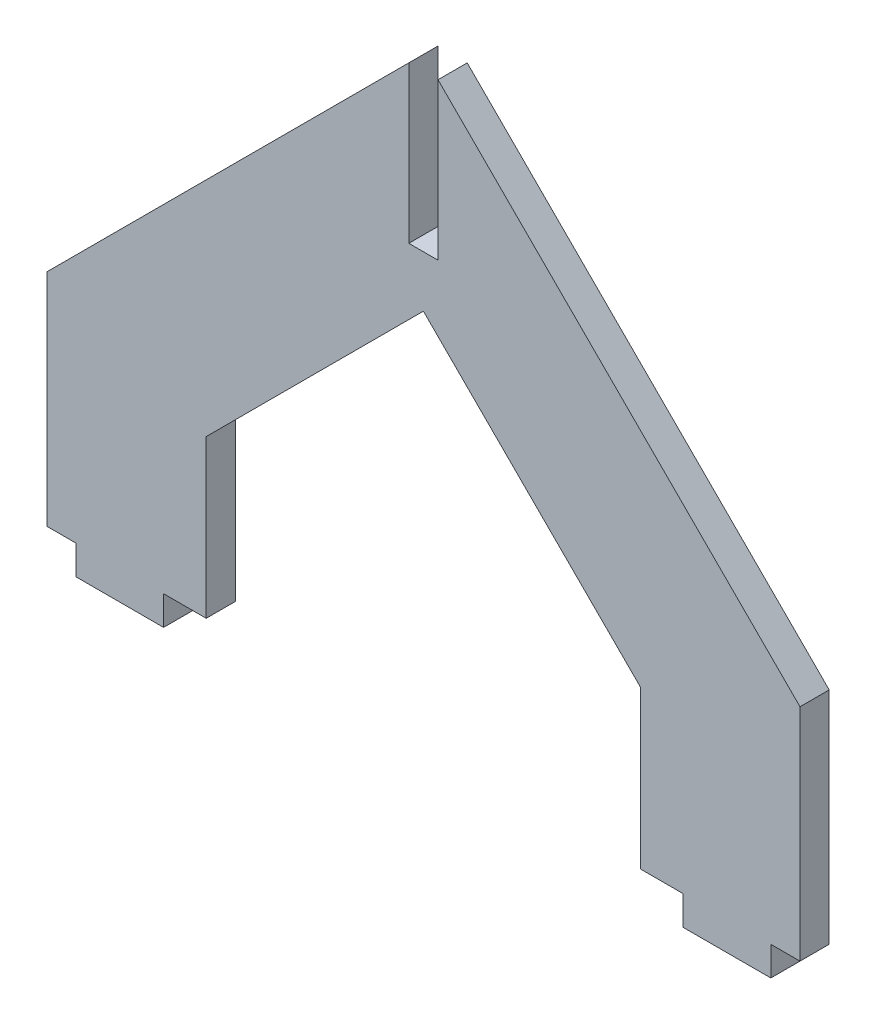
ISO-10303-21;
HEADER;
FILE_DESCRIPTION(('STEP AP214'),'2;1');
FILE_NAME('part.step','',(''),(''),'','','');
FILE_SCHEMA(('AUTOMOTIVE_DESIGN { 1 0 10303 214 1 1 1 1 }'));
ENDSEC;
DATA;
#1=APPLICATION_CONTEXT('core data for automotive mechanical design processes');
#2=APPLICATION_PROTOCOL_DEFINITION('international standard','automotive_design',2000,#1);
#3=PRODUCT_CONTEXT('',#1,'mechanical');
#4=PRODUCT('Part','Part','',(#3));
#5=PRODUCT_RELATED_PRODUCT_CATEGORY('part','',(#4));
#6=PRODUCT_DEFINITION_FORMATION('','',#4);
#7=PRODUCT_DEFINITION_CONTEXT('part definition',#1,'design');
#8=PRODUCT_DEFINITION('design','',#6,#7);
#9=PRODUCT_DEFINITION_SHAPE('','',#8);
#10=(LENGTH_UNIT() NAMED_UNIT(*) SI_UNIT(.MILLI.,.METRE.));
#11=(NAMED_UNIT(*) PLANE_ANGLE_UNIT() SI_UNIT($,.RADIAN.));
#12=(NAMED_UNIT(*) SI_UNIT($,.STERADIAN.) SOLID_ANGLE_UNIT());
#13=UNCERTAINTY_MEASURE_WITH_UNIT(LENGTH_MEASURE(1.E-05),#10,'distance_accuracy_value','');
#14=(GEOMETRIC_REPRESENTATION_CONTEXT(3) GLOBAL_UNCERTAINTY_ASSIGNED_CONTEXT((#13)) GLOBAL_UNIT_ASSIGNED_CONTEXT((#10,
#11,#12)) REPRESENTATION_CONTEXT('',''));
#15=CARTESIAN_POINT('',(0.,0.,0.));
#16=DIRECTION('',(0.,0.,1.));
#17=DIRECTION('',(1.,0.,0.));
#18=AXIS2_PLACEMENT_3D('',#15,#16,#17);
#19=CARTESIAN_POINT('',(34.6518602601974,42.7238945147287,5.));
#20=DIRECTION('',(0.707106781186547,-0.707106781186548,0.));
#21=DIRECTION('',(0.707106781186548,0.707106781186547,0.));
#22=AXIS2_PLACEMENT_3D('',#19,#20,#21);
#23=PLANE('',#22);
#24=DIRECTION('',(-0.707106781186548,-0.707106781186547,0.));
#25=VECTOR('',#24,1.);
#26=CARTESIAN_POINT('',(34.6518602601974,42.7238945147287,5.));
#27=LINE('',#26,#25);
#28=CARTESIAN_POINT('',(96.6389828727342,104.711017127265,5.));
#29=VERTEX_POINT('',#28);
#30=CARTESIAN_POINT('',(34.6518602601974,42.7238945147287,5.));
#31=VERTEX_POINT('',#30);
#32=EDGE_CURVE('E160',#29,#31,#27,.T.);
#33=ORIENTED_EDGE('',*,*,#32,.F.);
#34=DIRECTION('',(0.,0.,-1.));
#35=VECTOR('',#34,1.);
#36=CARTESIAN_POINT('',(96.6389828727342,104.711017127265,5.));
#37=LINE('',#36,#35);
#38=CARTESIAN_POINT('',(96.6389828727342,104.711017127265,0.));
#39=VERTEX_POINT('',#38);
#40=EDGE_CURVE('E280',#29,#39,#37,.T.);
#41=ORIENTED_EDGE('',*,*,#40,.T.);
#42=DIRECTION('',(-0.707106781186548,-0.707106781186547,0.));
#43=VECTOR('',#42,1.);
#44=CARTESIAN_POINT('',(34.6518602601974,42.7238945147287,0.));
#45=LINE('',#44,#43);
#46=CARTESIAN_POINT('',(34.6518602601974,42.7238945147287,0.));
#47=VERTEX_POINT('',#46);
#48=EDGE_CURVE('E141',#39,#47,#45,.T.);
#49=ORIENTED_EDGE('',*,*,#48,.T.);
#50=DIRECTION('',(0.,0.,1.));
#51=VECTOR('',#50,1.);
#52=CARTESIAN_POINT('',(34.6518602601974,42.7238945147287,5.));
#53=LINE('',#52,#51);
#54=EDGE_CURVE('E252',#47,#31,#53,.T.);
#55=ORIENTED_EDGE('',*,*,#54,.T.);
#56=EDGE_LOOP('',(#33,#41,#49,#55));
#57=FACE_BOUND('',#56,.T.);
#58=ADVANCED_FACE('F37',(#57),#23,.F.);
#59=CARTESIAN_POINT('',(34.6518602601974,5.,5.));
#60=DIRECTION('',(1.,0.,0.));
#61=DIRECTION('',(0.,0.,-1.));
#62=AXIS2_PLACEMENT_3D('',#59,#60,#61);
#63=PLANE('',#62);
#64=DIRECTION('',(0.,-1.,0.));
#65=VECTOR('',#64,1.);
#66=CARTESIAN_POINT('',(34.6518602601974,5.,5.));
#67=LINE('',#66,#65);
#68=CARTESIAN_POINT('',(34.6518602601974,5.,5.));
#69=VERTEX_POINT('',#68);
#70=EDGE_CURVE('E97',#31,#69,#67,.T.);
#71=ORIENTED_EDGE('',*,*,#70,.F.);
#72=ORIENTED_EDGE('',*,*,#54,.F.);
#73=DIRECTION('',(0.,-1.,0.));
#74=VECTOR('',#73,1.);
#75=CARTESIAN_POINT('',(34.6518602601974,5.,0.));
#76=LINE('',#75,#74);
#77=CARTESIAN_POINT('',(34.6518602601974,5.,0.));
#78=VERTEX_POINT('',#77);
#79=EDGE_CURVE('E144',#47,#78,#76,.T.);
#80=ORIENTED_EDGE('',*,*,#79,.T.);
#81=DIRECTION('',(0.,0.,-1.));
#82=VECTOR('',#81,1.);
#83=CARTESIAN_POINT('',(34.6518602601974,5.,5.));
#84=LINE('',#83,#82);
#85=EDGE_CURVE('E44',#69,#78,#84,.T.);
#86=ORIENTED_EDGE('',*,*,#85,.F.);
#87=EDGE_LOOP('',(#71,#72,#80,#86));
#88=FACE_BOUND('',#87,.T.);
#89=ADVANCED_FACE('F323',(#88),#63,.F.);
#90=CARTESIAN_POINT('',(39.6518602601974,5.,5.));
#91=DIRECTION('',(0.,1.,0.));
#92=DIRECTION('',(-1.,0.,0.));
#93=AXIS2_PLACEMENT_3D('',#90,#91,#92);
#94=PLANE('',#93);
#95=DIRECTION('',(1.,0.,0.));
#96=VECTOR('',#95,1.);
#97=CARTESIAN_POINT('',(39.6518602601974,5.,0.));
#98=LINE('',#97,#96);
#99=CARTESIAN_POINT('',(39.6518602601974,5.,0.));
#100=VERTEX_POINT('',#99);
#101=EDGE_CURVE('E147',#78,#100,#98,.T.);
#102=ORIENTED_EDGE('',*,*,#101,.T.);
#103=DIRECTION('',(0.,0.,-1.));
#104=VECTOR('',#103,1.);
#105=CARTESIAN_POINT('',(39.6518602601974,5.,5.));
#106=LINE('',#105,#104);
#107=CARTESIAN_POINT('',(39.6518602601974,5.,5.));
#108=VERTEX_POINT('',#107);
#109=EDGE_CURVE('E167',#108,#100,#106,.T.);
#110=ORIENTED_EDGE('',*,*,#109,.F.);
#111=DIRECTION('',(1.,0.,0.));
#112=VECTOR('',#111,1.);
#113=CARTESIAN_POINT('',(39.6518602601974,5.,5.));
#114=LINE('',#113,#112);
#115=EDGE_CURVE('E175',#69,#108,#114,.T.);
#116=ORIENTED_EDGE('',*,*,#115,.F.);
#117=ORIENTED_EDGE('',*,*,#85,.T.);
#118=EDGE_LOOP('',(#102,#110,#116,#117));
#119=FACE_BOUND('',#118,.T.);
#120=ADVANCED_FACE('F173',(#119),#94,.F.);
#121=CARTESIAN_POINT('',(39.6518602601974,0.,5.));
#122=DIRECTION('',(1.,0.,0.));
#123=DIRECTION('',(0.,0.,-1.));
#124=AXIS2_PLACEMENT_3D('',#121,#122,#123);
#125=PLANE('',#124);
#126=DIRECTION('',(0.,-1.,0.));
#127=VECTOR('',#126,1.);
#128=CARTESIAN_POINT('',(39.6518602601974,0.,0.));
#129=LINE('',#128,#127);
#130=CARTESIAN_POINT('',(39.6518602601974,0.,0.));
#131=VERTEX_POINT('',#130);
#132=EDGE_CURVE('E149',#100,#131,#129,.T.);
#133=ORIENTED_EDGE('',*,*,#132,.T.);
#134=DIRECTION('',(0.,0.,-1.));
#135=VECTOR('',#134,1.);
#136=CARTESIAN_POINT('',(39.6518602601974,0.,5.));
#137=LINE('',#136,#135);
#138=CARTESIAN_POINT('',(39.6518602601974,0.,5.));
#139=VERTEX_POINT('',#138);
#140=EDGE_CURVE('E164',#139,#131,#137,.T.);
#141=ORIENTED_EDGE('',*,*,#140,.F.);
#142=DIRECTION('',(0.,-1.,0.));
#143=VECTOR('',#142,1.);
#144=CARTESIAN_POINT('',(39.6518602601974,0.,5.));
#145=LINE('',#144,#143);
#146=EDGE_CURVE('E191',#108,#139,#145,.T.);
#147=ORIENTED_EDGE('',*,*,#146,.F.);
#148=ORIENTED_EDGE('',*,*,#109,.T.);
#149=EDGE_LOOP('',(#133,#141,#147,#148));
#150=FACE_BOUND('',#149,.T.);
#151=ADVANCED_FACE('F187',(#150),#125,.F.);
#152=CARTESIAN_POINT('',(54.6518602601974,0.,5.));
#153=DIRECTION('',(0.,1.,0.));
#154=DIRECTION('',(-1.,0.,0.));
#155=AXIS2_PLACEMENT_3D('',#152,#153,#154);
#156=PLANE('',#155);
#157=DIRECTION('',(1.,0.,0.));
#158=VECTOR('',#157,1.);
#159=CARTESIAN_POINT('',(54.6518602601974,0.,0.));
#160=LINE('',#159,#158);
#161=CARTESIAN_POINT('',(54.6518602601974,0.,0.));
#162=VERTEX_POINT('',#161);
#163=EDGE_CURVE('E151',#131,#162,#160,.T.);
#164=ORIENTED_EDGE('',*,*,#163,.T.);
#165=DIRECTION('',(0.,0.,-1.));
#166=VECTOR('',#165,1.);
#167=CARTESIAN_POINT('',(54.6518602601974,0.,5.));
#168=LINE('',#167,#166);
#169=CARTESIAN_POINT('',(54.6518602601974,0.,5.));
#170=VERTEX_POINT('',#169);
#171=EDGE_CURVE('E130',#170,#162,#168,.T.);
#172=ORIENTED_EDGE('',*,*,#171,.F.);
#173=DIRECTION('',(1.,0.,0.));
#174=VECTOR('',#173,1.);
#175=CARTESIAN_POINT('',(54.6518602601974,0.,5.));
#176=LINE('',#175,#174);
#177=EDGE_CURVE('E118',#139,#170,#176,.T.);
#178=ORIENTED_EDGE('',*,*,#177,.F.);
#179=ORIENTED_EDGE('',*,*,#140,.T.);
#180=EDGE_LOOP('',(#164,#172,#178,#179));
#181=FACE_BOUND('',#180,.T.);
#182=ADVANCED_FACE('F190',(#181),#156,.F.);
#183=CARTESIAN_POINT('',(54.6518602601974,5.,5.));
#184=DIRECTION('',(-1.,0.,0.));
#185=DIRECTION('',(0.,0.,1.));
#186=AXIS2_PLACEMENT_3D('',#183,#184,#185);
#187=PLANE('',#186);
#188=DIRECTION('',(0.,1.,0.));
#189=VECTOR('',#188,1.);
#190=CARTESIAN_POINT('',(54.6518602601974,5.,0.));
#191=LINE('',#190,#189);
#192=CARTESIAN_POINT('',(54.6518602601974,5.,0.));
#193=VERTEX_POINT('',#192);
#194=EDGE_CURVE('E127',#162,#193,#191,.T.);
#195=ORIENTED_EDGE('',*,*,#194,.T.);
#196=DIRECTION('',(0.,0.,-1.));
#197=VECTOR('',#196,1.);
#198=CARTESIAN_POINT('',(54.6518602601974,5.,5.));
#199=LINE('',#198,#197);
#200=CARTESIAN_POINT('',(54.6518602601974,5.,5.));
#201=VERTEX_POINT('',#200);
#202=EDGE_CURVE('E124',#201,#193,#199,.T.);
#203=ORIENTED_EDGE('',*,*,#202,.F.);
#204=DIRECTION('',(0.,1.,0.));
#205=VECTOR('',#204,1.);
#206=CARTESIAN_POINT('',(54.6518602601974,5.,5.));
#207=LINE('',#206,#205);
#208=EDGE_CURVE('E110',#170,#201,#207,.T.);
#209=ORIENTED_EDGE('',*,*,#208,.F.);
#210=ORIENTED_EDGE('',*,*,#171,.T.);
#211=EDGE_LOOP('',(#195,#203,#209,#210));
#212=FACE_BOUND('',#211,.T.);
#213=ADVANCED_FACE('F125',(#212),#187,.F.);
#214=CARTESIAN_POINT('',(61.9504190814651,5.,5.));
#215=DIRECTION('',(0.,1.,0.));
#216=DIRECTION('',(-1.,0.,0.));
#217=AXIS2_PLACEMENT_3D('',#214,#215,#216);
#218=PLANE('',#217);
#219=DIRECTION('',(1.,0.,0.));
#220=VECTOR('',#219,1.);
#221=CARTESIAN_POINT('',(61.9504190814651,5.,0.));
#222=LINE('',#221,#220);
#223=CARTESIAN_POINT('',(61.9504190814651,5.,0.));
#224=VERTEX_POINT('',#223);
#225=EDGE_CURVE('E154',#193,#224,#222,.T.);
#226=ORIENTED_EDGE('',*,*,#225,.T.);
#227=DIRECTION('',(0.,0.,-1.));
#228=VECTOR('',#227,1.);
#229=CARTESIAN_POINT('',(61.9504190814651,5.,5.));
#230=LINE('',#229,#228);
#231=CARTESIAN_POINT('',(61.9504190814651,5.,5.));
#232=VERTEX_POINT('',#231);
#233=EDGE_CURVE('E131',#232,#224,#230,.T.);
#234=ORIENTED_EDGE('',*,*,#233,.F.);
#235=DIRECTION('',(1.,0.,0.));
#236=VECTOR('',#235,1.);
#237=CARTESIAN_POINT('',(61.9504190814651,5.,5.));
#238=LINE('',#237,#236);
#239=EDGE_CURVE('E115',#201,#232,#238,.T.);
#240=ORIENTED_EDGE('',*,*,#239,.F.);
#241=ORIENTED_EDGE('',*,*,#202,.T.);
#242=EDGE_LOOP('',(#226,#234,#240,#241));
#243=FACE_BOUND('',#242,.T.);
#244=ADVANCED_FACE('F133',(#243),#218,.F.);
#245=CARTESIAN_POINT('',(61.9504190814651,31.9504190814651,5.));
#246=DIRECTION('',(-1.,0.,0.));
#247=DIRECTION('',(0.,0.,1.));
#248=AXIS2_PLACEMENT_3D('',#245,#246,#247);
#249=PLANE('',#248);
#250=DIRECTION('',(0.,1.,0.));
#251=VECTOR('',#250,1.);
#252=CARTESIAN_POINT('',(61.9504190814651,31.9504190814651,0.));
#253=LINE('',#252,#251);
#254=CARTESIAN_POINT('',(61.9504190814651,31.9504190814651,0.));
#255=VERTEX_POINT('',#254);
#256=EDGE_CURVE('E89',#224,#255,#253,.T.);
#257=ORIENTED_EDGE('',*,*,#256,.T.);
#258=DIRECTION('',(0.,0.,-1.));
#259=VECTOR('',#258,1.);
#260=CARTESIAN_POINT('',(61.9504190814651,31.9504190814651,5.));
#261=LINE('',#260,#259);
#262=CARTESIAN_POINT('',(61.9504190814651,31.9504190814651,5.));
#263=VERTEX_POINT('',#262);
#264=EDGE_CURVE('E140',#263,#255,#261,.T.);
#265=ORIENTED_EDGE('',*,*,#264,.F.);
#266=DIRECTION('',(0.,1.,0.));
#267=VECTOR('',#266,1.);
#268=CARTESIAN_POINT('',(61.9504190814651,31.9504190814651,5.));
#269=LINE('',#268,#267);
#270=EDGE_CURVE('E59',#232,#263,#269,.T.);
#271=ORIENTED_EDGE('',*,*,#270,.F.);
#272=ORIENTED_EDGE('',*,*,#233,.T.);
#273=EDGE_LOOP('',(#257,#265,#271,#272));
#274=FACE_BOUND('',#273,.T.);
#275=ADVANCED_FACE('F375',(#274),#249,.F.);
#276=CARTESIAN_POINT('',(100.675,70.675,5.));
#277=DIRECTION('',(-0.707106781186548,0.707106781186547,0.));
#278=DIRECTION('',(-0.707106781186547,-0.707106781186548,0.));
#279=AXIS2_PLACEMENT_3D('',#276,#277,#278);
#280=PLANE('',#279);
#281=DIRECTION('',(0.707106781186547,0.707106781186548,0.));
#282=VECTOR('',#281,1.);
#283=CARTESIAN_POINT('',(100.675,70.675,0.));
#284=LINE('',#283,#282);
#285=CARTESIAN_POINT('',(99.1389828727343,69.1389828727343,0.));
#286=VERTEX_POINT('',#285);
#287=EDGE_CURVE('E157',#255,#286,#284,.T.);
#288=ORIENTED_EDGE('',*,*,#287,.T.);
#289=DIRECTION('',(0.,0.,1.));
#290=VECTOR('',#289,1.);
#291=CARTESIAN_POINT('',(99.1389828727343,69.1389828727343,5.));
#292=LINE('',#291,#290);
#293=CARTESIAN_POINT('',(99.1389828727343,69.1389828727343,5.));
#294=VERTEX_POINT('',#293);
#295=EDGE_CURVE('E145',#286,#294,#292,.T.);
#296=ORIENTED_EDGE('',*,*,#295,.T.);
#297=DIRECTION('',(0.707106781186547,0.707106781186548,0.));
#298=VECTOR('',#297,1.);
#299=CARTESIAN_POINT('',(100.675,70.675,5.));
#300=LINE('',#299,#298);
#301=EDGE_CURVE('E135',#263,#294,#300,.T.);
#302=ORIENTED_EDGE('',*,*,#301,.F.);
#303=ORIENTED_EDGE('',*,*,#264,.T.);
#304=EDGE_LOOP('',(#288,#296,#302,#303));
#305=FACE_BOUND('',#304,.T.);
#306=ADVANCED_FACE('F374',(#305),#280,.F.);
#307=CARTESIAN_POINT('',(0.,0.,5.));
#308=DIRECTION('',(0.,0.,1.));
#309=DIRECTION('',(1.,0.,0.));
#310=AXIS2_PLACEMENT_3D('',#307,#308,#309);
#311=PLANE('',#310);
#312=DIRECTION('',(0.,-1.,0.));
#313=VECTOR('',#312,1.);
#314=CARTESIAN_POINT('',(96.6389828727342,0.,5.));
#315=LINE('',#314,#313);
#316=CARTESIAN_POINT('',(96.6389828727342,77.950332785119,5.));
#317=VERTEX_POINT('',#316);
#318=EDGE_CURVE('E283',#29,#317,#315,.T.);
#319=ORIENTED_EDGE('',*,*,#318,.F.);
#320=ORIENTED_EDGE('',*,*,#32,.T.);
#321=ORIENTED_EDGE('',*,*,#70,.T.);
#322=ORIENTED_EDGE('',*,*,#115,.T.);
#323=ORIENTED_EDGE('',*,*,#146,.T.);
#324=ORIENTED_EDGE('',*,*,#177,.T.);
#325=ORIENTED_EDGE('',*,*,#208,.T.);
#326=ORIENTED_EDGE('',*,*,#239,.T.);
#327=ORIENTED_EDGE('',*,*,#270,.T.);
#328=ORIENTED_EDGE('',*,*,#301,.T.);
#329=DIRECTION('',(-0.707106781186547,0.707106781186548,0.));
#330=VECTOR('',#329,1.);
#331=CARTESIAN_POINT('',(97.6029657454686,70.675,5.));
#332=LINE('',#331,#330);
#333=CARTESIAN_POINT('',(136.327546664003,31.9504190814651,5.));
#334=VERTEX_POINT('',#333);
#335=EDGE_CURVE('E227',#334,#294,#332,.T.);
#336=ORIENTED_EDGE('',*,*,#335,.F.);
#337=DIRECTION('',(0.,1.,0.));
#338=VECTOR('',#337,1.);
#339=CARTESIAN_POINT('',(136.327546664003,31.9504190814651,5.));
#340=LINE('',#339,#338);
#341=CARTESIAN_POINT('',(136.327546664003,5.,5.));
#342=VERTEX_POINT('',#341);
#343=EDGE_CURVE('E273',#342,#334,#340,.T.);
#344=ORIENTED_EDGE('',*,*,#343,.F.);
#345=DIRECTION('',(-1.,0.,0.));
#346=VECTOR('',#345,1.);
#347=CARTESIAN_POINT('',(136.327546664003,5.,5.));
#348=LINE('',#347,#346);
#349=CARTESIAN_POINT('',(143.626105485271,5.,5.));
#350=VERTEX_POINT('',#349);
#351=EDGE_CURVE('E270',#350,#342,#348,.T.);
#352=ORIENTED_EDGE('',*,*,#351,.F.);
#353=DIRECTION('',(0.,1.,0.));
#354=VECTOR('',#353,1.);
#355=CARTESIAN_POINT('',(143.626105485271,5.,5.));
#356=LINE('',#355,#354);
#357=CARTESIAN_POINT('',(143.626105485271,0.,5.));
#358=VERTEX_POINT('',#357);
#359=EDGE_CURVE('E267',#358,#350,#356,.T.);
#360=ORIENTED_EDGE('',*,*,#359,.F.);
#361=DIRECTION('',(-1.,0.,0.));
#362=VECTOR('',#361,1.);
#363=CARTESIAN_POINT('',(143.626105485271,0.,5.));
#364=LINE('',#363,#362);
#365=CARTESIAN_POINT('',(158.626105485271,0.,5.));
#366=VERTEX_POINT('',#365);
#367=EDGE_CURVE('E264',#366,#358,#364,.T.);
#368=ORIENTED_EDGE('',*,*,#367,.F.);
#369=DIRECTION('',(0.,-1.,0.));
#370=VECTOR('',#369,1.);
#371=CARTESIAN_POINT('',(158.626105485271,0.,5.));
#372=LINE('',#371,#370);
#373=CARTESIAN_POINT('',(158.626105485271,5.,5.));
#374=VERTEX_POINT('',#373);
#375=EDGE_CURVE('E261',#374,#366,#372,.T.);
#376=ORIENTED_EDGE('',*,*,#375,.F.);
#377=DIRECTION('',(-1.,0.,0.));
#378=VECTOR('',#377,1.);
#379=CARTESIAN_POINT('',(158.626105485271,5.,5.));
#380=LINE('',#379,#378);
#381=CARTESIAN_POINT('',(163.626105485271,5.,5.));
#382=VERTEX_POINT('',#381);
#383=EDGE_CURVE('E258',#382,#374,#380,.T.);
#384=ORIENTED_EDGE('',*,*,#383,.F.);
#385=DIRECTION('',(0.,-1.,0.));
#386=VECTOR('',#385,1.);
#387=CARTESIAN_POINT('',(163.626105485271,5.,5.));
#388=LINE('',#387,#386);
#389=CARTESIAN_POINT('',(163.626105485271,42.7238945147287,5.));
#390=VERTEX_POINT('',#389);
#391=EDGE_CURVE('E255',#390,#382,#388,.T.);
#392=ORIENTED_EDGE('',*,*,#391,.F.);
#393=DIRECTION('',(0.707106781186548,-0.707106781186547,0.));
#394=VECTOR('',#393,1.);
#395=CARTESIAN_POINT('',(163.626105485271,42.7238945147287,5.));
#396=LINE('',#395,#394);
#397=CARTESIAN_POINT('',(101.638982872734,104.711017127266,5.));
#398=VERTEX_POINT('',#397);
#399=EDGE_CURVE('E223',#398,#390,#396,.T.);
#400=ORIENTED_EDGE('',*,*,#399,.F.);
#401=DIRECTION('',(0.,1.,0.));
#402=VECTOR('',#401,1.);
#403=CARTESIAN_POINT('',(101.638982872734,0.,5.));
#404=LINE('',#403,#402);
#405=CARTESIAN_POINT('',(101.638982872734,77.950332785119,5.));
#406=VERTEX_POINT('',#405);
#407=EDGE_CURVE('E50',#406,#398,#404,.T.);
#408=ORIENTED_EDGE('',*,*,#407,.F.);
#409=DIRECTION('',(1.,0.,0.));
#410=VECTOR('',#409,1.);
#411=CARTESIAN_POINT('',(0.,77.950332785119,5.));
#412=LINE('',#411,#410);
#413=EDGE_CURVE('E286',#317,#406,#412,.T.);
#414=ORIENTED_EDGE('',*,*,#413,.F.);
#415=EDGE_LOOP('',(#319,#320,#321,#322,#323,#324,#325,#326,#327,#328,#336,#344,#352,#360,#368,
#376,#384,#392,#400,#408,#414));
#416=FACE_BOUND('',#415,.T.);
#417=ADVANCED_FACE('F113',(#416),#311,.T.);
#418=CARTESIAN_POINT('',(0.,0.,0.));
#419=DIRECTION('',(0.,0.,1.));
#420=DIRECTION('',(1.,0.,0.));
#421=AXIS2_PLACEMENT_3D('',#418,#419,#420);
#422=PLANE('',#421);
#423=ORIENTED_EDGE('',*,*,#48,.F.);
#424=DIRECTION('',(0.,1.,0.));
#425=VECTOR('',#424,1.);
#426=CARTESIAN_POINT('',(96.6389828727342,136.471701469412,0.));
#427=LINE('',#426,#425);
#428=CARTESIAN_POINT('',(96.6389828727342,77.950332785119,0.));
#429=VERTEX_POINT('',#428);
#430=EDGE_CURVE('E302',#429,#39,#427,.T.);
#431=ORIENTED_EDGE('',*,*,#430,.F.);
#432=DIRECTION('',(-1.,0.,0.));
#433=VECTOR('',#432,1.);
#434=CARTESIAN_POINT('',(101.638982872734,77.950332785119,0.));
#435=LINE('',#434,#433);
#436=CARTESIAN_POINT('',(101.638982872734,77.950332785119,0.));
#437=VERTEX_POINT('',#436);
#438=EDGE_CURVE('E294',#437,#429,#435,.T.);
#439=ORIENTED_EDGE('',*,*,#438,.F.);
#440=DIRECTION('',(0.,-1.,0.));
#441=VECTOR('',#440,1.);
#442=CARTESIAN_POINT('',(101.638982872734,136.471701469412,0.));
#443=LINE('',#442,#441);
#444=CARTESIAN_POINT('',(101.638982872734,104.711017127266,0.));
#445=VERTEX_POINT('',#444);
#446=EDGE_CURVE('E299',#445,#437,#443,.T.);
#447=ORIENTED_EDGE('',*,*,#446,.F.);
#448=DIRECTION('',(0.707106781186548,-0.707106781186547,0.));
#449=VECTOR('',#448,1.);
#450=CARTESIAN_POINT('',(163.626105485271,42.7238945147287,0.));
#451=LINE('',#450,#449);
#452=CARTESIAN_POINT('',(163.626105485271,42.7238945147287,0.));
#453=VERTEX_POINT('',#452);
#454=EDGE_CURVE('E224',#445,#453,#451,.T.);
#455=ORIENTED_EDGE('',*,*,#454,.T.);
#456=DIRECTION('',(0.,-1.,0.));
#457=VECTOR('',#456,1.);
#458=CARTESIAN_POINT('',(163.626105485271,5.,0.));
#459=LINE('',#458,#457);
#460=CARTESIAN_POINT('',(163.626105485271,5.,0.));
#461=VERTEX_POINT('',#460);
#462=EDGE_CURVE('E228',#453,#461,#459,.T.);
#463=ORIENTED_EDGE('',*,*,#462,.T.);
#464=DIRECTION('',(-1.,0.,0.));
#465=VECTOR('',#464,1.);
#466=CARTESIAN_POINT('',(158.626105485271,5.,0.));
#467=LINE('',#466,#465);
#468=CARTESIAN_POINT('',(158.626105485271,5.,0.));
#469=VERTEX_POINT('',#468);
#470=EDGE_CURVE('E231',#461,#469,#467,.T.);
#471=ORIENTED_EDGE('',*,*,#470,.T.);
#472=DIRECTION('',(0.,-1.,0.));
#473=VECTOR('',#472,1.);
#474=CARTESIAN_POINT('',(158.626105485271,0.,0.));
#475=LINE('',#474,#473);
#476=CARTESIAN_POINT('',(158.626105485271,0.,0.));
#477=VERTEX_POINT('',#476);
#478=EDGE_CURVE('E234',#469,#477,#475,.T.);
#479=ORIENTED_EDGE('',*,*,#478,.T.);
#480=DIRECTION('',(-1.,0.,0.));
#481=VECTOR('',#480,1.);
#482=CARTESIAN_POINT('',(143.626105485271,0.,0.));
#483=LINE('',#482,#481);
#484=CARTESIAN_POINT('',(143.626105485271,0.,0.));
#485=VERTEX_POINT('',#484);
#486=EDGE_CURVE('E237',#477,#485,#483,.T.);
#487=ORIENTED_EDGE('',*,*,#486,.T.);
#488=DIRECTION('',(0.,1.,0.));
#489=VECTOR('',#488,1.);
#490=CARTESIAN_POINT('',(143.626105485271,5.,0.));
#491=LINE('',#490,#489);
#492=CARTESIAN_POINT('',(143.626105485271,5.,0.));
#493=VERTEX_POINT('',#492);
#494=EDGE_CURVE('E240',#485,#493,#491,.T.);
#495=ORIENTED_EDGE('',*,*,#494,.T.);
#496=DIRECTION('',(-1.,0.,0.));
#497=VECTOR('',#496,1.);
#498=CARTESIAN_POINT('',(136.327546664003,5.,0.));
#499=LINE('',#498,#497);
#500=CARTESIAN_POINT('',(136.327546664003,5.,0.));
#501=VERTEX_POINT('',#500);
#502=EDGE_CURVE('E243',#493,#501,#499,.T.);
#503=ORIENTED_EDGE('',*,*,#502,.T.);
#504=DIRECTION('',(0.,1.,0.));
#505=VECTOR('',#504,1.);
#506=CARTESIAN_POINT('',(136.327546664003,31.9504190814651,0.));
#507=LINE('',#506,#505);
#508=CARTESIAN_POINT('',(136.327546664003,31.9504190814651,0.));
#509=VERTEX_POINT('',#508);
#510=EDGE_CURVE('E246',#501,#509,#507,.T.);
#511=ORIENTED_EDGE('',*,*,#510,.T.);
#512=DIRECTION('',(-0.707106781186547,0.707106781186548,0.));
#513=VECTOR('',#512,1.);
#514=CARTESIAN_POINT('',(97.6029657454686,70.675,0.));
#515=LINE('',#514,#513);
#516=EDGE_CURVE('E249',#509,#286,#515,.T.);
#517=ORIENTED_EDGE('',*,*,#516,.T.);
#518=ORIENTED_EDGE('',*,*,#287,.F.);
#519=ORIENTED_EDGE('',*,*,#256,.F.);
#520=ORIENTED_EDGE('',*,*,#225,.F.);
#521=ORIENTED_EDGE('',*,*,#194,.F.);
#522=ORIENTED_EDGE('',*,*,#163,.F.);
#523=ORIENTED_EDGE('',*,*,#132,.F.);
#524=ORIENTED_EDGE('',*,*,#101,.F.);
#525=ORIENTED_EDGE('',*,*,#79,.F.);
#526=EDGE_LOOP('',(#423,#431,#439,#447,#455,#463,#471,#479,#487,#495,#503,#511,#517,#518,#519,
#520,#521,#522,#523,#524,#525));
#527=FACE_BOUND('',#526,.T.);
#528=ADVANCED_FACE('F181',(#527),#422,.F.);
#529=CARTESIAN_POINT('',(136.327546664003,31.9504190814651,5.));
#530=DIRECTION('',(-1.,0.,0.));
#531=DIRECTION('',(0.,0.,1.));
#532=AXIS2_PLACEMENT_3D('',#529,#530,#531);
#533=PLANE('',#532);
#534=ORIENTED_EDGE('',*,*,#510,.F.);
#535=DIRECTION('',(0.,0.,-1.));
#536=VECTOR('',#535,1.);
#537=CARTESIAN_POINT('',(136.327546664003,5.,5.));
#538=LINE('',#537,#536);
#539=EDGE_CURVE('E202',#342,#501,#538,.T.);
#540=ORIENTED_EDGE('',*,*,#539,.F.);
#541=ORIENTED_EDGE('',*,*,#343,.T.);
#542=DIRECTION('',(0.,0.,-1.));
#543=VECTOR('',#542,1.);
#544=CARTESIAN_POINT('',(136.327546664003,31.9504190814651,5.));
#545=LINE('',#544,#543);
#546=EDGE_CURVE('E199',#334,#509,#545,.T.);
#547=ORIENTED_EDGE('',*,*,#546,.T.);
#548=EDGE_LOOP('',(#534,#540,#541,#547));
#549=FACE_BOUND('',#548,.T.);
#550=ADVANCED_FACE('F423',(#549),#533,.T.);
#551=CARTESIAN_POINT('',(136.327546664003,5.,5.));
#552=DIRECTION('',(0.,-1.,0.));
#553=DIRECTION('',(1.,0.,0.));
#554=AXIS2_PLACEMENT_3D('',#551,#552,#553);
#555=PLANE('',#554);
#556=ORIENTED_EDGE('',*,*,#502,.F.);
#557=DIRECTION('',(0.,0.,-1.));
#558=VECTOR('',#557,1.);
#559=CARTESIAN_POINT('',(143.626105485271,5.,5.));
#560=LINE('',#559,#558);
#561=EDGE_CURVE('E205',#350,#493,#560,.T.);
#562=ORIENTED_EDGE('',*,*,#561,.F.);
#563=ORIENTED_EDGE('',*,*,#351,.T.);
#564=ORIENTED_EDGE('',*,*,#539,.T.);
#565=EDGE_LOOP('',(#556,#562,#563,#564));
#566=FACE_BOUND('',#565,.T.);
#567=ADVANCED_FACE('F428',(#566),#555,.T.);
#568=CARTESIAN_POINT('',(143.626105485271,5.,5.));
#569=DIRECTION('',(-1.,0.,0.));
#570=DIRECTION('',(0.,0.,1.));
#571=AXIS2_PLACEMENT_3D('',#568,#569,#570);
#572=PLANE('',#571);
#573=ORIENTED_EDGE('',*,*,#494,.F.);
#574=DIRECTION('',(0.,0.,-1.));
#575=VECTOR('',#574,1.);
#576=CARTESIAN_POINT('',(143.626105485271,0.,5.));
#577=LINE('',#576,#575);
#578=EDGE_CURVE('E208',#358,#485,#577,.T.);
#579=ORIENTED_EDGE('',*,*,#578,.F.);
#580=ORIENTED_EDGE('',*,*,#359,.T.);
#581=ORIENTED_EDGE('',*,*,#561,.T.);
#582=EDGE_LOOP('',(#573,#579,#580,#581));
#583=FACE_BOUND('',#582,.T.);
#584=ADVANCED_FACE('F440',(#583),#572,.T.);
#585=CARTESIAN_POINT('',(143.626105485271,0.,5.));
#586=DIRECTION('',(0.,-1.,0.));
#587=DIRECTION('',(1.,0.,0.));
#588=AXIS2_PLACEMENT_3D('',#585,#586,#587);
#589=PLANE('',#588);
#590=ORIENTED_EDGE('',*,*,#486,.F.);
#591=DIRECTION('',(0.,0.,-1.));
#592=VECTOR('',#591,1.);
#593=CARTESIAN_POINT('',(158.626105485271,0.,5.));
#594=LINE('',#593,#592);
#595=EDGE_CURVE('E211',#366,#477,#594,.T.);
#596=ORIENTED_EDGE('',*,*,#595,.F.);
#597=ORIENTED_EDGE('',*,*,#367,.T.);
#598=ORIENTED_EDGE('',*,*,#578,.T.);
#599=EDGE_LOOP('',(#590,#596,#597,#598));
#600=FACE_BOUND('',#599,.T.);
#601=ADVANCED_FACE('F450',(#600),#589,.T.);
#602=CARTESIAN_POINT('',(158.626105485271,0.,5.));
#603=DIRECTION('',(1.,0.,0.));
#604=DIRECTION('',(0.,0.,-1.));
#605=AXIS2_PLACEMENT_3D('',#602,#603,#604);
#606=PLANE('',#605);
#607=ORIENTED_EDGE('',*,*,#478,.F.);
#608=DIRECTION('',(0.,0.,-1.));
#609=VECTOR('',#608,1.);
#610=CARTESIAN_POINT('',(158.626105485271,5.,5.));
#611=LINE('',#610,#609);
#612=EDGE_CURVE('E214',#374,#469,#611,.T.);
#613=ORIENTED_EDGE('',*,*,#612,.F.);
#614=ORIENTED_EDGE('',*,*,#375,.T.);
#615=ORIENTED_EDGE('',*,*,#595,.T.);
#616=EDGE_LOOP('',(#607,#613,#614,#615));
#617=FACE_BOUND('',#616,.T.);
#618=ADVANCED_FACE('F460',(#617),#606,.T.);
#619=CARTESIAN_POINT('',(158.626105485271,5.,5.));
#620=DIRECTION('',(0.,-1.,0.));
#621=DIRECTION('',(1.,0.,0.));
#622=AXIS2_PLACEMENT_3D('',#619,#620,#621);
#623=PLANE('',#622);
#624=ORIENTED_EDGE('',*,*,#470,.F.);
#625=DIRECTION('',(0.,0.,-1.));
#626=VECTOR('',#625,1.);
#627=CARTESIAN_POINT('',(163.626105485271,5.,5.));
#628=LINE('',#627,#626);
#629=EDGE_CURVE('E217',#382,#461,#628,.T.);
#630=ORIENTED_EDGE('',*,*,#629,.F.);
#631=ORIENTED_EDGE('',*,*,#383,.T.);
#632=ORIENTED_EDGE('',*,*,#612,.T.);
#633=EDGE_LOOP('',(#624,#630,#631,#632));
#634=FACE_BOUND('',#633,.T.);
#635=ADVANCED_FACE('F470',(#634),#623,.T.);
#636=CARTESIAN_POINT('',(163.626105485271,5.,5.));
#637=DIRECTION('',(1.,0.,0.));
#638=DIRECTION('',(0.,0.,-1.));
#639=AXIS2_PLACEMENT_3D('',#636,#637,#638);
#640=PLANE('',#639);
#641=ORIENTED_EDGE('',*,*,#462,.F.);
#642=DIRECTION('',(0.,0.,-1.));
#643=VECTOR('',#642,1.);
#644=CARTESIAN_POINT('',(163.626105485271,42.7238945147287,5.));
#645=LINE('',#644,#643);
#646=EDGE_CURVE('E220',#390,#453,#645,.T.);
#647=ORIENTED_EDGE('',*,*,#646,.F.);
#648=ORIENTED_EDGE('',*,*,#391,.T.);
#649=ORIENTED_EDGE('',*,*,#629,.T.);
#650=EDGE_LOOP('',(#641,#647,#648,#649));
#651=FACE_BOUND('',#650,.T.);
#652=ADVANCED_FACE('F480',(#651),#640,.T.);
#653=CARTESIAN_POINT('',(163.626105485271,42.7238945147287,5.));
#654=DIRECTION('',(0.707106781186547,0.707106781186548,0.));
#655=DIRECTION('',(-0.707106781186548,0.707106781186547,0.));
#656=AXIS2_PLACEMENT_3D('',#653,#654,#655);
#657=PLANE('',#656);
#658=DIRECTION('',(0.,0.,-1.));
#659=VECTOR('',#658,1.);
#660=CARTESIAN_POINT('',(101.638982872734,104.711017127266,5.));
#661=LINE('',#660,#659);
#662=EDGE_CURVE('E11',#398,#445,#661,.T.);
#663=ORIENTED_EDGE('',*,*,#662,.F.);
#664=ORIENTED_EDGE('',*,*,#399,.T.);
#665=ORIENTED_EDGE('',*,*,#646,.T.);
#666=ORIENTED_EDGE('',*,*,#454,.F.);
#667=EDGE_LOOP('',(#663,#664,#665,#666));
#668=FACE_BOUND('',#667,.T.);
#669=ADVANCED_FACE('F490',(#668),#657,.T.);
#670=CARTESIAN_POINT('',(97.6029657454686,70.675,5.));
#671=DIRECTION('',(-0.707106781186548,-0.707106781186547,0.));
#672=DIRECTION('',(0.707106781186547,-0.707106781186548,0.));
#673=AXIS2_PLACEMENT_3D('',#670,#671,#672);
#674=PLANE('',#673);
#675=ORIENTED_EDGE('',*,*,#295,.F.);
#676=ORIENTED_EDGE('',*,*,#516,.F.);
#677=ORIENTED_EDGE('',*,*,#546,.F.);
#678=ORIENTED_EDGE('',*,*,#335,.T.);
#679=EDGE_LOOP('',(#675,#676,#677,#678));
#680=FACE_BOUND('',#679,.T.);
#681=ADVANCED_FACE('F371',(#680),#674,.T.);
#682=CARTESIAN_POINT('',(96.6389828727342,136.471701469412,10.));
#683=DIRECTION('',(-1.,0.,0.));
#684=DIRECTION('',(0.,0.,1.));
#685=AXIS2_PLACEMENT_3D('',#682,#683,#684);
#686=PLANE('',#685);
#687=ORIENTED_EDGE('',*,*,#318,.T.);
#688=DIRECTION('',(0.,0.,-1.));
#689=VECTOR('',#688,1.);
#690=CARTESIAN_POINT('',(96.6389828727342,77.950332785119,10.));
#691=LINE('',#690,#689);
#692=EDGE_CURVE('E290',#317,#429,#691,.T.);
#693=ORIENTED_EDGE('',*,*,#692,.T.);
#694=ORIENTED_EDGE('',*,*,#430,.T.);
#695=ORIENTED_EDGE('',*,*,#40,.F.);
#696=EDGE_LOOP('',(#687,#693,#694,#695));
#697=FACE_BOUND('',#696,.T.);
#698=ADVANCED_FACE('F308',(#697),#686,.F.);
#699=CARTESIAN_POINT('',(101.638982872734,77.950332785119,10.));
#700=DIRECTION('',(0.,-1.,0.));
#701=DIRECTION('',(0.,0.,-1.));
#702=AXIS2_PLACEMENT_3D('',#699,#700,#701);
#703=PLANE('',#702);
#704=ORIENTED_EDGE('',*,*,#413,.T.);
#705=DIRECTION('',(0.,0.,-1.));
#706=VECTOR('',#705,1.);
#707=CARTESIAN_POINT('',(101.638982872734,77.950332785119,10.));
#708=LINE('',#707,#706);
#709=EDGE_CURVE('E291',#406,#437,#708,.T.);
#710=ORIENTED_EDGE('',*,*,#709,.T.);
#711=ORIENTED_EDGE('',*,*,#438,.T.);
#712=ORIENTED_EDGE('',*,*,#692,.F.);
#713=EDGE_LOOP('',(#704,#710,#711,#712));
#714=FACE_BOUND('',#713,.T.);
#715=ADVANCED_FACE('F541',(#714),#703,.F.);
#716=CARTESIAN_POINT('',(101.638982872734,136.471701469412,10.));
#717=DIRECTION('',(1.,0.,0.));
#718=DIRECTION('',(0.,0.,-1.));
#719=AXIS2_PLACEMENT_3D('',#716,#717,#718);
#720=PLANE('',#719);
#721=ORIENTED_EDGE('',*,*,#407,.T.);
#722=ORIENTED_EDGE('',*,*,#662,.T.);
#723=ORIENTED_EDGE('',*,*,#446,.T.);
#724=ORIENTED_EDGE('',*,*,#709,.F.);
#725=EDGE_LOOP('',(#721,#722,#723,#724));
#726=FACE_BOUND('',#725,.T.);
#727=ADVANCED_FACE('F550',(#726),#720,.F.);
#728=CLOSED_SHELL('',(#58,#89,#120,#151,#182,#213,#244,#275,#306,#417,#528,#550,#567,#584,#601,
#618,#635,#652,#669,#681,#698,#715,#727));
#729=MANIFOLD_SOLID_BREP('B2',#728);
#730=ADVANCED_BREP_SHAPE_REPRESENTATION('',(#18,#729),#14);
#731=SHAPE_DEFINITION_REPRESENTATION(#9,#730);
ENDSEC;
END-ISO-10303-21;
